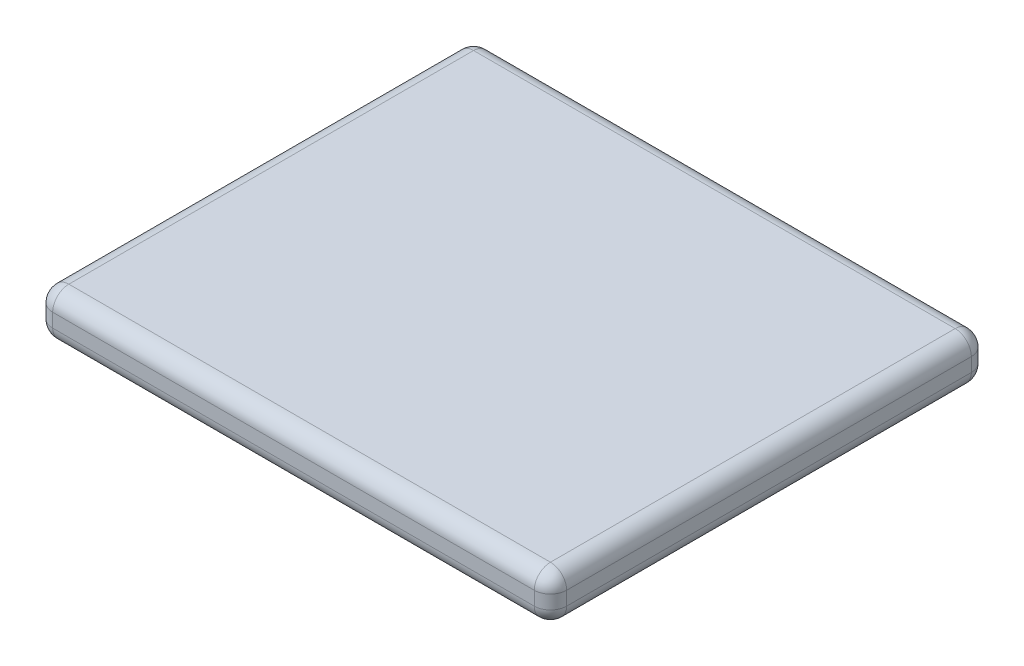
ISO-10303-21;
HEADER;
FILE_DESCRIPTION(('STEP AP214'),'2;1');
FILE_NAME('part.step','',(''),(''),'','','');
FILE_SCHEMA(('AUTOMOTIVE_DESIGN { 1 0 10303 214 1 1 1 1 }'));
ENDSEC;
DATA;
#1=APPLICATION_CONTEXT('core data for automotive mechanical design processes');
#2=APPLICATION_PROTOCOL_DEFINITION('international standard','automotive_design',2000,#1);
#3=PRODUCT_CONTEXT('',#1,'mechanical');
#4=PRODUCT('Part','Part','',(#3));
#5=PRODUCT_RELATED_PRODUCT_CATEGORY('part','',(#4));
#6=PRODUCT_DEFINITION_FORMATION('','',#4);
#7=PRODUCT_DEFINITION_CONTEXT('part definition',#1,'design');
#8=PRODUCT_DEFINITION('design','',#6,#7);
#9=PRODUCT_DEFINITION_SHAPE('','',#8);
#10=(LENGTH_UNIT() NAMED_UNIT(*) SI_UNIT(.MILLI.,.METRE.));
#11=(NAMED_UNIT(*) PLANE_ANGLE_UNIT() SI_UNIT($,.RADIAN.));
#12=(NAMED_UNIT(*) SI_UNIT($,.STERADIAN.) SOLID_ANGLE_UNIT());
#13=UNCERTAINTY_MEASURE_WITH_UNIT(LENGTH_MEASURE(1.E-05),#10,'distance_accuracy_value','');
#14=(GEOMETRIC_REPRESENTATION_CONTEXT(3) GLOBAL_UNCERTAINTY_ASSIGNED_CONTEXT((#13)) GLOBAL_UNIT_ASSIGNED_CONTEXT((#10,
#11,#12)) REPRESENTATION_CONTEXT('',''));
#15=CARTESIAN_POINT('',(0.,0.,0.));
#16=DIRECTION('',(0.,0.,1.));
#17=DIRECTION('',(1.,0.,0.));
#18=AXIS2_PLACEMENT_3D('',#15,#16,#17);
#19=CARTESIAN_POINT('',(0.,5.7,0.));
#20=DIRECTION('',(1.,0.,0.));
#21=DIRECTION('',(0.,0.,-1.));
#22=AXIS2_PLACEMENT_3D('',#19,#20,#21);
#23=PLANE('',#22);
#24=DIRECTION('',(0.,-1.,0.));
#25=VECTOR('',#24,1.);
#26=CARTESIAN_POINT('',(0.,5.7,-52.));
#27=LINE('',#26,#25);
#28=CARTESIAN_POINT('',(0.,3.7,-52.));
#29=VERTEX_POINT('',#28);
#30=CARTESIAN_POINT('',(0.,2.,-52.));
#31=VERTEX_POINT('',#30);
#32=EDGE_CURVE('E152',#29,#31,#27,.T.);
#33=ORIENTED_EDGE('',*,*,#32,.T.);
#34=DIRECTION('',(0.,0.,1.));
#35=VECTOR('',#34,1.);
#36=CARTESIAN_POINT('',(0.,2.,0.));
#37=LINE('',#36,#35);
#38=CARTESIAN_POINT('',(0.,2.,-2.));
#39=VERTEX_POINT('',#38);
#40=EDGE_CURVE('E126',#31,#39,#37,.T.);
#41=ORIENTED_EDGE('',*,*,#40,.T.);
#42=DIRECTION('',(0.,-1.,0.));
#43=VECTOR('',#42,1.);
#44=CARTESIAN_POINT('',(0.,5.7,-2.));
#45=LINE('',#44,#43);
#46=CARTESIAN_POINT('',(0.,3.7,-2.));
#47=VERTEX_POINT('',#46);
#48=EDGE_CURVE('E143',#39,#47,#45,.F.);
#49=ORIENTED_EDGE('',*,*,#48,.T.);
#50=DIRECTION('',(0.,0.,1.));
#51=VECTOR('',#50,1.);
#52=CARTESIAN_POINT('',(0.,3.7,0.));
#53=LINE('',#52,#51);
#54=EDGE_CURVE('E149',#47,#29,#53,.F.);
#55=ORIENTED_EDGE('',*,*,#54,.T.);
#56=EDGE_LOOP('',(#33,#41,#49,#55));
#57=FACE_BOUND('',#56,.T.);
#58=ADVANCED_FACE('F33',(#57),#23,.F.);
#59=CARTESIAN_POINT('',(0.,5.7,0.));
#60=DIRECTION('',(0.,0.,-1.));
#61=DIRECTION('',(-1.,0.,0.));
#62=AXIS2_PLACEMENT_3D('',#59,#60,#61);
#63=PLANE('',#62);
#64=DIRECTION('',(0.,-1.,0.));
#65=VECTOR('',#64,1.);
#66=CARTESIAN_POINT('',(2.,5.7,0.));
#67=LINE('',#66,#65);
#68=CARTESIAN_POINT('',(2.,3.7,0.));
#69=VERTEX_POINT('',#68);
#70=CARTESIAN_POINT('',(2.,2.,0.));
#71=VERTEX_POINT('',#70);
#72=EDGE_CURVE('E53',#69,#71,#67,.T.);
#73=ORIENTED_EDGE('',*,*,#72,.T.);
#74=DIRECTION('',(1.,0.,0.));
#75=VECTOR('',#74,1.);
#76=CARTESIAN_POINT('',(63.5,2.,0.));
#77=LINE('',#76,#75);
#78=CARTESIAN_POINT('',(61.5,2.,0.));
#79=VERTEX_POINT('',#78);
#80=EDGE_CURVE('E11',#71,#79,#77,.T.);
#81=ORIENTED_EDGE('',*,*,#80,.T.);
#82=DIRECTION('',(0.,-1.,0.));
#83=VECTOR('',#82,1.);
#84=CARTESIAN_POINT('',(61.5,5.7,0.));
#85=LINE('',#84,#83);
#86=CARTESIAN_POINT('',(61.5,3.7,0.));
#87=VERTEX_POINT('',#86);
#88=EDGE_CURVE('E42',#79,#87,#85,.F.);
#89=ORIENTED_EDGE('',*,*,#88,.T.);
#90=DIRECTION('',(1.,0.,0.));
#91=VECTOR('',#90,1.);
#92=CARTESIAN_POINT('',(0.,3.7,0.));
#93=LINE('',#92,#91);
#94=EDGE_CURVE('E192',#87,#69,#93,.F.);
#95=ORIENTED_EDGE('',*,*,#94,.T.);
#96=EDGE_LOOP('',(#73,#81,#89,#95));
#97=FACE_BOUND('',#96,.T.);
#98=ADVANCED_FACE('F316',(#97),#63,.F.);
#99=CARTESIAN_POINT('',(63.5,5.7,0.));
#100=DIRECTION('',(-1.,0.,0.));
#101=DIRECTION('',(0.,0.,1.));
#102=AXIS2_PLACEMENT_3D('',#99,#100,#101);
#103=PLANE('',#102);
#104=DIRECTION('',(0.,0.,-1.));
#105=VECTOR('',#104,1.);
#106=CARTESIAN_POINT('',(63.5,2.,-54.));
#107=LINE('',#106,#105);
#108=CARTESIAN_POINT('',(63.5,2.,-2.));
#109=VERTEX_POINT('',#108);
#110=CARTESIAN_POINT('',(63.5,2.,-52.));
#111=VERTEX_POINT('',#110);
#112=EDGE_CURVE('E187',#109,#111,#107,.T.);
#113=ORIENTED_EDGE('',*,*,#112,.T.);
#114=DIRECTION('',(0.,-1.,0.));
#115=VECTOR('',#114,1.);
#116=CARTESIAN_POINT('',(63.5,5.7,-52.));
#117=LINE('',#116,#115);
#118=CARTESIAN_POINT('',(63.5,3.7,-52.));
#119=VERTEX_POINT('',#118);
#120=EDGE_CURVE('E189',#111,#119,#117,.F.);
#121=ORIENTED_EDGE('',*,*,#120,.T.);
#122=DIRECTION('',(0.,0.,-1.));
#123=VECTOR('',#122,1.);
#124=CARTESIAN_POINT('',(63.5,3.7,0.));
#125=LINE('',#124,#123);
#126=CARTESIAN_POINT('',(63.5,3.7,-2.));
#127=VERTEX_POINT('',#126);
#128=EDGE_CURVE('E185',#119,#127,#125,.F.);
#129=ORIENTED_EDGE('',*,*,#128,.T.);
#130=DIRECTION('',(0.,-1.,0.));
#131=VECTOR('',#130,1.);
#132=CARTESIAN_POINT('',(63.5,5.7,-2.));
#133=LINE('',#132,#131);
#134=EDGE_CURVE('E183',#127,#109,#133,.T.);
#135=ORIENTED_EDGE('',*,*,#134,.T.);
#136=EDGE_LOOP('',(#113,#121,#129,#135));
#137=FACE_BOUND('',#136,.T.);
#138=ADVANCED_FACE('F264',(#137),#103,.F.);
#139=CARTESIAN_POINT('',(0.,5.7,-54.));
#140=DIRECTION('',(0.,0.,1.));
#141=DIRECTION('',(1.,0.,0.));
#142=AXIS2_PLACEMENT_3D('',#139,#140,#141);
#143=PLANE('',#142);
#144=DIRECTION('',(-1.,0.,0.));
#145=VECTOR('',#144,1.);
#146=CARTESIAN_POINT('',(0.,2.,-54.));
#147=LINE('',#146,#145);
#148=CARTESIAN_POINT('',(61.5,2.,-54.));
#149=VERTEX_POINT('',#148);
#150=CARTESIAN_POINT('',(2.,2.,-54.));
#151=VERTEX_POINT('',#150);
#152=EDGE_CURVE('E169',#149,#151,#147,.T.);
#153=ORIENTED_EDGE('',*,*,#152,.T.);
#154=DIRECTION('',(0.,-1.,0.));
#155=VECTOR('',#154,1.);
#156=CARTESIAN_POINT('',(2.,5.7,-54.));
#157=LINE('',#156,#155);
#158=CARTESIAN_POINT('',(2.,3.7,-54.));
#159=VERTEX_POINT('',#158);
#160=EDGE_CURVE('E172',#151,#159,#157,.F.);
#161=ORIENTED_EDGE('',*,*,#160,.T.);
#162=DIRECTION('',(-1.,0.,0.));
#163=VECTOR('',#162,1.);
#164=CARTESIAN_POINT('',(0.,3.7,-54.));
#165=LINE('',#164,#163);
#166=CARTESIAN_POINT('',(61.5,3.7,-54.));
#167=VERTEX_POINT('',#166);
#168=EDGE_CURVE('E167',#159,#167,#165,.F.);
#169=ORIENTED_EDGE('',*,*,#168,.T.);
#170=DIRECTION('',(0.,-1.,0.));
#171=VECTOR('',#170,1.);
#172=CARTESIAN_POINT('',(61.5,5.7,-54.));
#173=LINE('',#172,#171);
#174=EDGE_CURVE('E165',#167,#149,#173,.T.);
#175=ORIENTED_EDGE('',*,*,#174,.T.);
#176=EDGE_LOOP('',(#153,#161,#169,#175));
#177=FACE_BOUND('',#176,.T.);
#178=ADVANCED_FACE('F285',(#177),#143,.F.);
#179=CARTESIAN_POINT('',(0.,5.7,0.));
#180=DIRECTION('',(0.,-1.,0.));
#181=DIRECTION('',(0.,0.,-1.));
#182=AXIS2_PLACEMENT_3D('',#179,#180,#181);
#183=PLANE('',#182);
#184=DIRECTION('',(0.,0.,-1.));
#185=VECTOR('',#184,1.);
#186=CARTESIAN_POINT('',(61.5,5.7,0.));
#187=LINE('',#186,#185);
#188=CARTESIAN_POINT('',(61.5,5.7,-2.));
#189=VERTEX_POINT('',#188);
#190=CARTESIAN_POINT('',(61.5,5.7,-52.));
#191=VERTEX_POINT('',#190);
#192=EDGE_CURVE('E178',#189,#191,#187,.T.);
#193=ORIENTED_EDGE('',*,*,#192,.T.);
#194=DIRECTION('',(-1.,0.,0.));
#195=VECTOR('',#194,1.);
#196=CARTESIAN_POINT('',(0.,5.7,-52.));
#197=LINE('',#196,#195);
#198=CARTESIAN_POINT('',(2.,5.7,-52.));
#199=VERTEX_POINT('',#198);
#200=EDGE_CURVE('E180',#191,#199,#197,.T.);
#201=ORIENTED_EDGE('',*,*,#200,.T.);
#202=DIRECTION('',(0.,0.,1.));
#203=VECTOR('',#202,1.);
#204=CARTESIAN_POINT('',(2.,5.7,0.));
#205=LINE('',#204,#203);
#206=CARTESIAN_POINT('',(2.,5.7,-2.));
#207=VERTEX_POINT('',#206);
#208=EDGE_CURVE('E176',#199,#207,#205,.T.);
#209=ORIENTED_EDGE('',*,*,#208,.T.);
#210=DIRECTION('',(1.,0.,0.));
#211=VECTOR('',#210,1.);
#212=CARTESIAN_POINT('',(0.,5.7,-2.));
#213=LINE('',#212,#211);
#214=EDGE_CURVE('E174',#207,#189,#213,.T.);
#215=ORIENTED_EDGE('',*,*,#214,.T.);
#216=EDGE_LOOP('',(#193,#201,#209,#215));
#217=FACE_BOUND('',#216,.T.);
#218=ADVANCED_FACE('F292',(#217),#183,.F.);
#219=CARTESIAN_POINT('',(0.,0.,0.));
#220=DIRECTION('',(0.,-1.,0.));
#221=DIRECTION('',(0.,0.,-1.));
#222=AXIS2_PLACEMENT_3D('',#219,#220,#221);
#223=PLANE('',#222);
#224=DIRECTION('',(1.,0.,0.));
#225=VECTOR('',#224,1.);
#226=CARTESIAN_POINT('',(0.,0.,-2.));
#227=LINE('',#226,#225);
#228=CARTESIAN_POINT('',(61.5,0.,-2.));
#229=VERTEX_POINT('',#228);
#230=CARTESIAN_POINT('',(2.,0.,-2.));
#231=VERTEX_POINT('',#230);
#232=EDGE_CURVE('E154',#229,#231,#227,.F.);
#233=ORIENTED_EDGE('',*,*,#232,.T.);
#234=DIRECTION('',(0.,0.,1.));
#235=VECTOR('',#234,1.);
#236=CARTESIAN_POINT('',(2.,0.,-54.));
#237=LINE('',#236,#235);
#238=CARTESIAN_POINT('',(2.,0.,-52.));
#239=VERTEX_POINT('',#238);
#240=EDGE_CURVE('E128',#231,#239,#237,.F.);
#241=ORIENTED_EDGE('',*,*,#240,.T.);
#242=DIRECTION('',(-1.,0.,0.));
#243=VECTOR('',#242,1.);
#244=CARTESIAN_POINT('',(63.5,0.,-52.));
#245=LINE('',#244,#243);
#246=CARTESIAN_POINT('',(61.5,0.,-52.));
#247=VERTEX_POINT('',#246);
#248=EDGE_CURVE('E162',#239,#247,#245,.F.);
#249=ORIENTED_EDGE('',*,*,#248,.T.);
#250=DIRECTION('',(0.,0.,-1.));
#251=VECTOR('',#250,1.);
#252=CARTESIAN_POINT('',(61.5,0.,0.));
#253=LINE('',#252,#251);
#254=EDGE_CURVE('E156',#247,#229,#253,.F.);
#255=ORIENTED_EDGE('',*,*,#254,.T.);
#256=EDGE_LOOP('',(#233,#241,#249,#255));
#257=FACE_BOUND('',#256,.T.);
#258=ADVANCED_FACE('F471',(#257),#223,.T.);
#259=CARTESIAN_POINT('',(61.5,3.7,0.));
#260=DIRECTION('',(0.,0.,-1.));
#261=DIRECTION('',(-1.,0.,0.));
#262=AXIS2_PLACEMENT_3D('',#259,#260,#261);
#263=CYLINDRICAL_SURFACE('',#262,2.);
#264=CARTESIAN_POINT('',(61.5,3.7,-52.));
#265=DIRECTION('',(0.,0.,-1.));
#266=DIRECTION('',(-1.,0.,0.));
#267=AXIS2_PLACEMENT_3D('',#264,#265,#266);
#268=CIRCLE('',#267,2.);
#269=EDGE_CURVE('E37',#191,#119,#268,.T.);
#270=ORIENTED_EDGE('',*,*,#269,.F.);
#271=ORIENTED_EDGE('',*,*,#192,.F.);
#272=CARTESIAN_POINT('',(61.5,3.7,-2.));
#273=DIRECTION('',(0.,0.,1.));
#274=DIRECTION('',(1.,0.,0.));
#275=AXIS2_PLACEMENT_3D('',#272,#273,#274);
#276=CIRCLE('',#275,2.);
#277=EDGE_CURVE('E245',#127,#189,#276,.T.);
#278=ORIENTED_EDGE('',*,*,#277,.F.);
#279=ORIENTED_EDGE('',*,*,#128,.F.);
#280=EDGE_LOOP('',(#270,#271,#278,#279));
#281=FACE_BOUND('',#280,.T.);
#282=ADVANCED_FACE('F35',(#281),#263,.T.);
#283=CARTESIAN_POINT('',(61.5,3.7,-52.));
#284=DIRECTION('',(1.,0.,0.));
#285=DIRECTION('',(0.,0.,-1.));
#286=AXIS2_PLACEMENT_3D('',#283,#284,#285);
#287=SPHERICAL_SURFACE('',#286,2.);
#288=CARTESIAN_POINT('',(61.5,3.7,-52.));
#289=DIRECTION('',(1.,0.,0.));
#290=DIRECTION('',(0.,0.,-1.));
#291=AXIS2_PLACEMENT_3D('',#288,#289,#290);
#292=CIRCLE('',#291,2.);
#293=EDGE_CURVE('E241',#191,#167,#292,.F.);
#294=ORIENTED_EDGE('',*,*,#293,.F.);
#295=ORIENTED_EDGE('',*,*,#269,.T.);
#296=CARTESIAN_POINT('',(61.5,3.7,-52.));
#297=DIRECTION('',(0.,1.,0.));
#298=DIRECTION('',(0.,0.,1.));
#299=AXIS2_PLACEMENT_3D('',#296,#297,#298);
#300=CIRCLE('',#299,2.);
#301=EDGE_CURVE('E244',#167,#119,#300,.F.);
#302=ORIENTED_EDGE('',*,*,#301,.F.);
#303=EDGE_LOOP('',(#294,#295,#302));
#304=FACE_BOUND('',#303,.T.);
#305=ADVANCED_FACE('F257',(#304),#287,.T.);
#306=CARTESIAN_POINT('',(61.5,3.7,-2.));
#307=DIRECTION('',(0.,1.,0.));
#308=DIRECTION('',(0.,0.,1.));
#309=AXIS2_PLACEMENT_3D('',#306,#307,#308);
#310=SPHERICAL_SURFACE('',#309,2.);
#311=CARTESIAN_POINT('',(61.5,3.7,-2.));
#312=DIRECTION('',(0.,1.,0.));
#313=DIRECTION('',(0.,0.,1.));
#314=AXIS2_PLACEMENT_3D('',#311,#312,#313);
#315=CIRCLE('',#314,2.);
#316=EDGE_CURVE('E235',#127,#87,#315,.F.);
#317=ORIENTED_EDGE('',*,*,#316,.F.);
#318=ORIENTED_EDGE('',*,*,#277,.T.);
#319=CARTESIAN_POINT('',(61.5,3.7,-2.));
#320=DIRECTION('',(1.,0.,0.));
#321=DIRECTION('',(0.,0.,-1.));
#322=AXIS2_PLACEMENT_3D('',#319,#320,#321);
#323=CIRCLE('',#322,2.);
#324=EDGE_CURVE('E238',#87,#189,#323,.F.);
#325=ORIENTED_EDGE('',*,*,#324,.F.);
#326=EDGE_LOOP('',(#317,#318,#325));
#327=FACE_BOUND('',#326,.T.);
#328=ADVANCED_FACE('F450',(#327),#310,.T.);
#329=CARTESIAN_POINT('',(61.5,5.7,-52.));
#330=DIRECTION('',(0.,-1.,0.));
#331=DIRECTION('',(0.,0.,-1.));
#332=AXIS2_PLACEMENT_3D('',#329,#330,#331);
#333=CYLINDRICAL_SURFACE('',#332,2.);
#334=ORIENTED_EDGE('',*,*,#301,.T.);
#335=ORIENTED_EDGE('',*,*,#120,.F.);
#336=CARTESIAN_POINT('',(61.5,2.,-52.));
#337=DIRECTION('',(0.,-1.,0.));
#338=DIRECTION('',(0.,0.,-1.));
#339=AXIS2_PLACEMENT_3D('',#336,#337,#338);
#340=CIRCLE('',#339,2.);
#341=EDGE_CURVE('E229',#149,#111,#340,.T.);
#342=ORIENTED_EDGE('',*,*,#341,.F.);
#343=ORIENTED_EDGE('',*,*,#174,.F.);
#344=EDGE_LOOP('',(#334,#335,#342,#343));
#345=FACE_BOUND('',#344,.T.);
#346=ADVANCED_FACE('F269',(#345),#333,.T.);
#347=CARTESIAN_POINT('',(0.,3.7,-52.));
#348=DIRECTION('',(-1.,0.,0.));
#349=DIRECTION('',(0.,0.,1.));
#350=AXIS2_PLACEMENT_3D('',#347,#348,#349);
#351=CYLINDRICAL_SURFACE('',#350,2.);
#352=ORIENTED_EDGE('',*,*,#293,.T.);
#353=ORIENTED_EDGE('',*,*,#168,.F.);
#354=CARTESIAN_POINT('',(2.,3.7,-52.));
#355=DIRECTION('',(-1.,0.,0.));
#356=DIRECTION('',(0.,0.,1.));
#357=AXIS2_PLACEMENT_3D('',#354,#355,#356);
#358=CIRCLE('',#357,2.);
#359=EDGE_CURVE('E226',#199,#159,#358,.T.);
#360=ORIENTED_EDGE('',*,*,#359,.F.);
#361=ORIENTED_EDGE('',*,*,#200,.F.);
#362=EDGE_LOOP('',(#352,#353,#360,#361));
#363=FACE_BOUND('',#362,.T.);
#364=ADVANCED_FACE('F289',(#363),#351,.T.);
#365=CARTESIAN_POINT('',(2.,3.7,0.));
#366=DIRECTION('',(0.,0.,1.));
#367=DIRECTION('',(1.,0.,0.));
#368=AXIS2_PLACEMENT_3D('',#365,#366,#367);
#369=CYLINDRICAL_SURFACE('',#368,2.);
#370=CARTESIAN_POINT('',(2.,3.7,-2.));
#371=DIRECTION('',(0.,0.,1.));
#372=DIRECTION('',(1.,0.,0.));
#373=AXIS2_PLACEMENT_3D('',#370,#371,#372);
#374=CIRCLE('',#373,2.);
#375=EDGE_CURVE('E221',#207,#47,#374,.T.);
#376=ORIENTED_EDGE('',*,*,#375,.F.);
#377=ORIENTED_EDGE('',*,*,#208,.F.);
#378=CARTESIAN_POINT('',(2.,3.7,-52.));
#379=DIRECTION('',(0.,0.,-1.));
#380=DIRECTION('',(-1.,0.,0.));
#381=AXIS2_PLACEMENT_3D('',#378,#379,#380);
#382=CIRCLE('',#381,2.);
#383=EDGE_CURVE('E224',#29,#199,#382,.T.);
#384=ORIENTED_EDGE('',*,*,#383,.F.);
#385=ORIENTED_EDGE('',*,*,#54,.F.);
#386=EDGE_LOOP('',(#376,#377,#384,#385));
#387=FACE_BOUND('',#386,.T.);
#388=ADVANCED_FACE('F299',(#387),#369,.T.);
#389=CARTESIAN_POINT('',(0.,3.7,-2.));
#390=DIRECTION('',(1.,0.,0.));
#391=DIRECTION('',(0.,0.,-1.));
#392=AXIS2_PLACEMENT_3D('',#389,#390,#391);
#393=CYLINDRICAL_SURFACE('',#392,2.);
#394=ORIENTED_EDGE('',*,*,#324,.T.);
#395=ORIENTED_EDGE('',*,*,#214,.F.);
#396=CARTESIAN_POINT('',(2.,3.7,-2.));
#397=DIRECTION('',(-1.,0.,0.));
#398=DIRECTION('',(0.,0.,1.));
#399=AXIS2_PLACEMENT_3D('',#396,#397,#398);
#400=CIRCLE('',#399,2.);
#401=EDGE_CURVE('E218',#69,#207,#400,.T.);
#402=ORIENTED_EDGE('',*,*,#401,.F.);
#403=ORIENTED_EDGE('',*,*,#94,.F.);
#404=EDGE_LOOP('',(#394,#395,#402,#403));
#405=FACE_BOUND('',#404,.T.);
#406=ADVANCED_FACE('F297',(#405),#393,.T.);
#407=CARTESIAN_POINT('',(61.5,5.7,-2.));
#408=DIRECTION('',(0.,-1.,0.));
#409=DIRECTION('',(0.,0.,-1.));
#410=AXIS2_PLACEMENT_3D('',#407,#408,#409);
#411=CYLINDRICAL_SURFACE('',#410,2.);
#412=ORIENTED_EDGE('',*,*,#316,.T.);
#413=ORIENTED_EDGE('',*,*,#88,.F.);
#414=CARTESIAN_POINT('',(61.5,2.,-2.));
#415=DIRECTION('',(0.,-1.,0.));
#416=DIRECTION('',(0.,0.,-1.));
#417=AXIS2_PLACEMENT_3D('',#414,#415,#416);
#418=CIRCLE('',#417,2.);
#419=EDGE_CURVE('E215',#109,#79,#418,.T.);
#420=ORIENTED_EDGE('',*,*,#419,.F.);
#421=ORIENTED_EDGE('',*,*,#134,.F.);
#422=EDGE_LOOP('',(#412,#413,#420,#421));
#423=FACE_BOUND('',#422,.T.);
#424=ADVANCED_FACE('F413',(#423),#411,.T.);
#425=CARTESIAN_POINT('',(61.5,2.,0.));
#426=DIRECTION('',(0.,0.,1.));
#427=DIRECTION('',(1.,0.,0.));
#428=AXIS2_PLACEMENT_3D('',#425,#426,#427);
#429=CYLINDRICAL_SURFACE('',#428,2.);
#430=CARTESIAN_POINT('',(61.5,2.,-52.));
#431=DIRECTION('',(0.,0.,-1.));
#432=DIRECTION('',(-1.,0.,0.));
#433=AXIS2_PLACEMENT_3D('',#430,#431,#432);
#434=CIRCLE('',#433,2.);
#435=EDGE_CURVE('E232',#111,#247,#434,.T.);
#436=ORIENTED_EDGE('',*,*,#435,.F.);
#437=ORIENTED_EDGE('',*,*,#112,.F.);
#438=CARTESIAN_POINT('',(61.5,2.,-2.));
#439=DIRECTION('',(0.,0.,1.));
#440=DIRECTION('',(1.,0.,0.));
#441=AXIS2_PLACEMENT_3D('',#438,#439,#440);
#442=CIRCLE('',#441,2.);
#443=EDGE_CURVE('E212',#229,#109,#442,.T.);
#444=ORIENTED_EDGE('',*,*,#443,.F.);
#445=ORIENTED_EDGE('',*,*,#254,.F.);
#446=EDGE_LOOP('',(#436,#437,#444,#445));
#447=FACE_BOUND('',#446,.T.);
#448=ADVANCED_FACE('F273',(#447),#429,.T.);
#449=CARTESIAN_POINT('',(61.5,2.,-52.));
#450=DIRECTION('',(1.,0.,0.));
#451=DIRECTION('',(0.,0.,-1.));
#452=AXIS2_PLACEMENT_3D('',#449,#450,#451);
#453=SPHERICAL_SURFACE('',#452,2.);
#454=ORIENTED_EDGE('',*,*,#341,.T.);
#455=ORIENTED_EDGE('',*,*,#435,.T.);
#456=CARTESIAN_POINT('',(61.5,2.,-52.));
#457=DIRECTION('',(1.,0.,0.));
#458=DIRECTION('',(0.,0.,-1.));
#459=AXIS2_PLACEMENT_3D('',#456,#457,#458);
#460=CIRCLE('',#459,2.);
#461=EDGE_CURVE('E209',#149,#247,#460,.F.);
#462=ORIENTED_EDGE('',*,*,#461,.F.);
#463=EDGE_LOOP('',(#454,#455,#462));
#464=FACE_BOUND('',#463,.T.);
#465=ADVANCED_FACE('F277',(#464),#453,.T.);
#466=CARTESIAN_POINT('',(2.,3.7,-52.));
#467=DIRECTION('',(0.,1.,0.));
#468=DIRECTION('',(0.,0.,1.));
#469=AXIS2_PLACEMENT_3D('',#466,#467,#468);
#470=SPHERICAL_SURFACE('',#469,2.);
#471=ORIENTED_EDGE('',*,*,#383,.T.);
#472=ORIENTED_EDGE('',*,*,#359,.T.);
#473=CARTESIAN_POINT('',(2.,3.7,-52.));
#474=DIRECTION('',(0.,1.,0.));
#475=DIRECTION('',(0.,0.,1.));
#476=AXIS2_PLACEMENT_3D('',#473,#474,#475);
#477=CIRCLE('',#476,2.);
#478=EDGE_CURVE('E206',#29,#159,#477,.F.);
#479=ORIENTED_EDGE('',*,*,#478,.F.);
#480=EDGE_LOOP('',(#471,#472,#479));
#481=FACE_BOUND('',#480,.T.);
#482=ADVANCED_FACE('F305',(#481),#470,.T.);
#483=CARTESIAN_POINT('',(2.,3.7,-2.));
#484=DIRECTION('',(0.,1.,0.));
#485=DIRECTION('',(0.,0.,1.));
#486=AXIS2_PLACEMENT_3D('',#483,#484,#485);
#487=SPHERICAL_SURFACE('',#486,2.);
#488=ORIENTED_EDGE('',*,*,#401,.T.);
#489=ORIENTED_EDGE('',*,*,#375,.T.);
#490=CARTESIAN_POINT('',(2.,3.7,-2.));
#491=DIRECTION('',(0.,1.,0.));
#492=DIRECTION('',(0.,0.,1.));
#493=AXIS2_PLACEMENT_3D('',#490,#491,#492);
#494=CIRCLE('',#493,2.);
#495=EDGE_CURVE('E146',#69,#47,#494,.F.);
#496=ORIENTED_EDGE('',*,*,#495,.F.);
#497=EDGE_LOOP('',(#488,#489,#496));
#498=FACE_BOUND('',#497,.T.);
#499=ADVANCED_FACE('F302',(#498),#487,.T.);
#500=CARTESIAN_POINT('',(61.5,2.,-2.));
#501=DIRECTION('',(1.,0.,0.));
#502=DIRECTION('',(0.,0.,-1.));
#503=AXIS2_PLACEMENT_3D('',#500,#501,#502);
#504=SPHERICAL_SURFACE('',#503,2.);
#505=ORIENTED_EDGE('',*,*,#443,.T.);
#506=ORIENTED_EDGE('',*,*,#419,.T.);
#507=CARTESIAN_POINT('',(61.5,2.,-2.));
#508=DIRECTION('',(1.,0.,0.));
#509=DIRECTION('',(0.,0.,-1.));
#510=AXIS2_PLACEMENT_3D('',#507,#508,#509);
#511=CIRCLE('',#510,2.);
#512=EDGE_CURVE('E202',#229,#79,#511,.F.);
#513=ORIENTED_EDGE('',*,*,#512,.F.);
#514=EDGE_LOOP('',(#505,#506,#513));
#515=FACE_BOUND('',#514,.T.);
#516=ADVANCED_FACE('F304',(#515),#504,.T.);
#517=CARTESIAN_POINT('',(0.,2.,-52.));
#518=DIRECTION('',(1.,0.,0.));
#519=DIRECTION('',(0.,0.,-1.));
#520=AXIS2_PLACEMENT_3D('',#517,#518,#519);
#521=CYLINDRICAL_SURFACE('',#520,2.);
#522=ORIENTED_EDGE('',*,*,#461,.T.);
#523=ORIENTED_EDGE('',*,*,#248,.F.);
#524=CARTESIAN_POINT('',(2.,2.,-52.));
#525=DIRECTION('',(-1.,0.,0.));
#526=DIRECTION('',(0.,0.,1.));
#527=AXIS2_PLACEMENT_3D('',#524,#525,#526);
#528=CIRCLE('',#527,2.);
#529=EDGE_CURVE('E199',#151,#239,#528,.T.);
#530=ORIENTED_EDGE('',*,*,#529,.F.);
#531=ORIENTED_EDGE('',*,*,#152,.F.);
#532=EDGE_LOOP('',(#522,#523,#530,#531));
#533=FACE_BOUND('',#532,.T.);
#534=ADVANCED_FACE('F282',(#533),#521,.T.);
#535=CARTESIAN_POINT('',(2.,5.7,-52.));
#536=DIRECTION('',(0.,-1.,0.));
#537=DIRECTION('',(0.,0.,-1.));
#538=AXIS2_PLACEMENT_3D('',#535,#536,#537);
#539=CYLINDRICAL_SURFACE('',#538,2.);
#540=ORIENTED_EDGE('',*,*,#478,.T.);
#541=ORIENTED_EDGE('',*,*,#160,.F.);
#542=CARTESIAN_POINT('',(2.,2.,-52.));
#543=DIRECTION('',(0.,-1.,0.));
#544=DIRECTION('',(0.,0.,-1.));
#545=AXIS2_PLACEMENT_3D('',#542,#543,#544);
#546=CIRCLE('',#545,2.);
#547=EDGE_CURVE('E140',#31,#151,#546,.T.);
#548=ORIENTED_EDGE('',*,*,#547,.F.);
#549=ORIENTED_EDGE('',*,*,#32,.F.);
#550=EDGE_LOOP('',(#540,#541,#548,#549));
#551=FACE_BOUND('',#550,.T.);
#552=ADVANCED_FACE('F338',(#551),#539,.T.);
#553=CARTESIAN_POINT('',(2.,5.7,-2.));
#554=DIRECTION('',(0.,-1.,0.));
#555=DIRECTION('',(0.,0.,-1.));
#556=AXIS2_PLACEMENT_3D('',#553,#554,#555);
#557=CYLINDRICAL_SURFACE('',#556,2.);
#558=ORIENTED_EDGE('',*,*,#495,.T.);
#559=ORIENTED_EDGE('',*,*,#48,.F.);
#560=CARTESIAN_POINT('',(2.,2.,-2.));
#561=DIRECTION('',(0.,-1.,0.));
#562=DIRECTION('',(0.,0.,-1.));
#563=AXIS2_PLACEMENT_3D('',#560,#561,#562);
#564=CIRCLE('',#563,2.);
#565=EDGE_CURVE('E134',#71,#39,#564,.T.);
#566=ORIENTED_EDGE('',*,*,#565,.F.);
#567=ORIENTED_EDGE('',*,*,#72,.F.);
#568=EDGE_LOOP('',(#558,#559,#566,#567));
#569=FACE_BOUND('',#568,.T.);
#570=ADVANCED_FACE('F144',(#569),#557,.T.);
#571=CARTESIAN_POINT('',(0.,2.,-2.));
#572=DIRECTION('',(-1.,0.,0.));
#573=DIRECTION('',(0.,0.,1.));
#574=AXIS2_PLACEMENT_3D('',#571,#572,#573);
#575=CYLINDRICAL_SURFACE('',#574,2.);
#576=ORIENTED_EDGE('',*,*,#512,.T.);
#577=ORIENTED_EDGE('',*,*,#80,.F.);
#578=CARTESIAN_POINT('',(2.,2.,-2.));
#579=DIRECTION('',(-1.,0.,0.));
#580=DIRECTION('',(0.,0.,1.));
#581=AXIS2_PLACEMENT_3D('',#578,#579,#580);
#582=CIRCLE('',#581,2.);
#583=EDGE_CURVE('E138',#231,#71,#582,.T.);
#584=ORIENTED_EDGE('',*,*,#583,.F.);
#585=ORIENTED_EDGE('',*,*,#232,.F.);
#586=EDGE_LOOP('',(#576,#577,#584,#585));
#587=FACE_BOUND('',#586,.T.);
#588=ADVANCED_FACE('F331',(#587),#575,.T.);
#589=CARTESIAN_POINT('',(2.,2.,-52.));
#590=DIRECTION('',(0.,0.,-1.));
#591=DIRECTION('',(-1.,0.,0.));
#592=AXIS2_PLACEMENT_3D('',#589,#590,#591);
#593=SPHERICAL_SURFACE('',#592,2.);
#594=ORIENTED_EDGE('',*,*,#547,.T.);
#595=ORIENTED_EDGE('',*,*,#529,.T.);
#596=CARTESIAN_POINT('',(2.,2.,-52.));
#597=DIRECTION('',(0.,0.,-1.));
#598=DIRECTION('',(-1.,0.,0.));
#599=AXIS2_PLACEMENT_3D('',#596,#597,#598);
#600=CIRCLE('',#599,2.);
#601=EDGE_CURVE('E131',#31,#239,#600,.F.);
#602=ORIENTED_EDGE('',*,*,#601,.F.);
#603=EDGE_LOOP('',(#594,#595,#602));
#604=FACE_BOUND('',#603,.T.);
#605=ADVANCED_FACE('F328',(#604),#593,.T.);
#606=CARTESIAN_POINT('',(2.,2.,-2.));
#607=DIRECTION('',(0.,0.,1.));
#608=DIRECTION('',(1.,0.,0.));
#609=AXIS2_PLACEMENT_3D('',#606,#607,#608);
#610=SPHERICAL_SURFACE('',#609,2.);
#611=ORIENTED_EDGE('',*,*,#583,.T.);
#612=ORIENTED_EDGE('',*,*,#565,.T.);
#613=CARTESIAN_POINT('',(2.,2.,-2.));
#614=DIRECTION('',(0.,0.,1.));
#615=DIRECTION('',(1.,0.,0.));
#616=AXIS2_PLACEMENT_3D('',#613,#614,#615);
#617=CIRCLE('',#616,2.);
#618=EDGE_CURVE('E122',#231,#39,#617,.F.);
#619=ORIENTED_EDGE('',*,*,#618,.F.);
#620=EDGE_LOOP('',(#611,#612,#619));
#621=FACE_BOUND('',#620,.T.);
#622=ADVANCED_FACE('F136',(#621),#610,.T.);
#623=CARTESIAN_POINT('',(2.,2.,0.));
#624=DIRECTION('',(0.,0.,-1.));
#625=DIRECTION('',(-1.,0.,0.));
#626=AXIS2_PLACEMENT_3D('',#623,#624,#625);
#627=CYLINDRICAL_SURFACE('',#626,2.);
#628=ORIENTED_EDGE('',*,*,#601,.T.);
#629=ORIENTED_EDGE('',*,*,#240,.F.);
#630=ORIENTED_EDGE('',*,*,#618,.T.);
#631=ORIENTED_EDGE('',*,*,#40,.F.);
#632=EDGE_LOOP('',(#628,#629,#630,#631));
#633=FACE_BOUND('',#632,.T.);
#634=ADVANCED_FACE('F124',(#633),#627,.T.);
#635=CLOSED_SHELL('',(#58,#98,#138,#178,#218,#258,#282,#305,#328,#346,#364,#388,#406,#424,#448,
#465,#482,#499,#516,#534,#552,#570,#588,#605,#622,#634));
#636=MANIFOLD_SOLID_BREP('B2',#635);
#637=ADVANCED_BREP_SHAPE_REPRESENTATION('',(#18,#636),#14);
#638=SHAPE_DEFINITION_REPRESENTATION(#9,#637);
ENDSEC;
END-ISO-10303-21;
